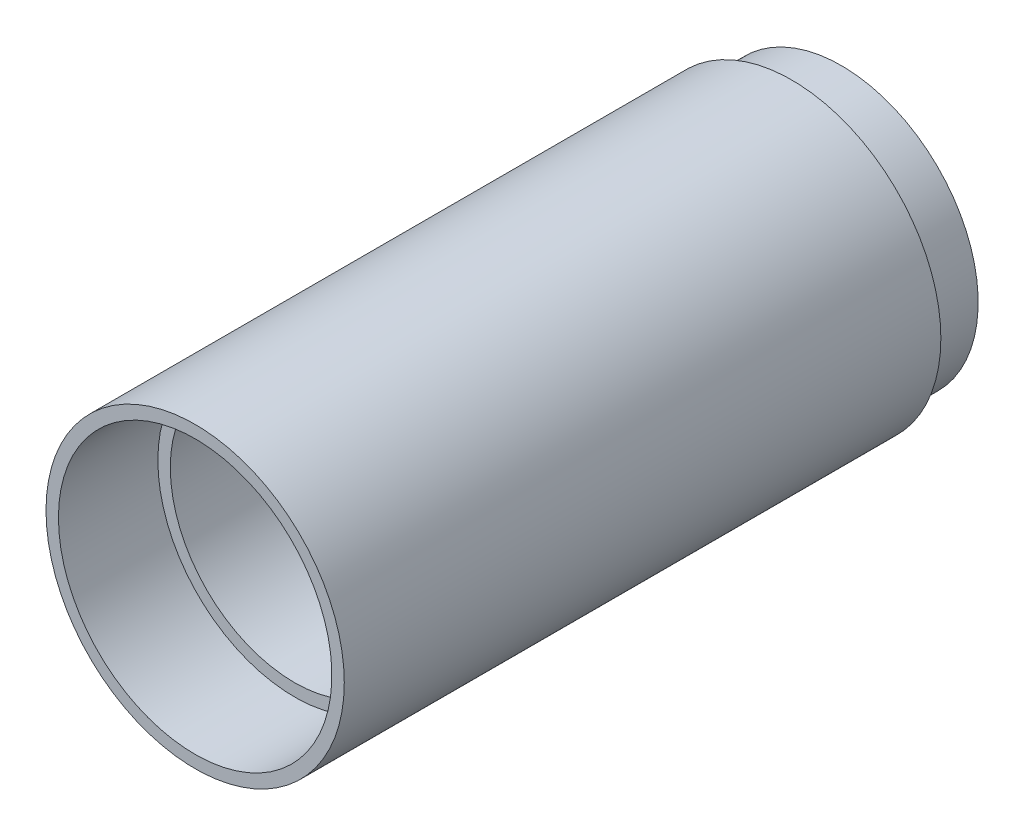
ISO-10303-21;
HEADER;
FILE_DESCRIPTION(('STEP AP214'),'2;1');
FILE_NAME('part.step','',(''),(''),'','','');
FILE_SCHEMA(('AUTOMOTIVE_DESIGN { 1 0 10303 214 1 1 1 1 }'));
ENDSEC;
DATA;
#1=APPLICATION_CONTEXT('core data for automotive mechanical design processes');
#2=APPLICATION_PROTOCOL_DEFINITION('international standard','automotive_design',2000,#1);
#3=PRODUCT_CONTEXT('',#1,'mechanical');
#4=PRODUCT('Part','Part','',(#3));
#5=PRODUCT_RELATED_PRODUCT_CATEGORY('part','',(#4));
#6=PRODUCT_DEFINITION_FORMATION('','',#4);
#7=PRODUCT_DEFINITION_CONTEXT('part definition',#1,'design');
#8=PRODUCT_DEFINITION('design','',#6,#7);
#9=PRODUCT_DEFINITION_SHAPE('','',#8);
#10=(LENGTH_UNIT() NAMED_UNIT(*) SI_UNIT(.MILLI.,.METRE.));
#11=(NAMED_UNIT(*) PLANE_ANGLE_UNIT() SI_UNIT($,.RADIAN.));
#12=(NAMED_UNIT(*) SI_UNIT($,.STERADIAN.) SOLID_ANGLE_UNIT());
#13=UNCERTAINTY_MEASURE_WITH_UNIT(LENGTH_MEASURE(1.E-05),#10,'distance_accuracy_value','');
#14=(GEOMETRIC_REPRESENTATION_CONTEXT(3) GLOBAL_UNCERTAINTY_ASSIGNED_CONTEXT((#13)) GLOBAL_UNIT_ASSIGNED_CONTEXT((#10,
#11,#12)) REPRESENTATION_CONTEXT('',''));
#15=CARTESIAN_POINT('',(0.,0.,0.));
#16=DIRECTION('',(0.,0.,1.));
#17=DIRECTION('',(1.,0.,0.));
#18=AXIS2_PLACEMENT_3D('',#15,#16,#17);
#19=CARTESIAN_POINT('',(-112.606133366651,79.5679002804118,200.));
#20=DIRECTION('',(0.,0.,1.));
#21=DIRECTION('',(1.,0.,0.));
#22=AXIS2_PLACEMENT_3D('',#19,#20,#21);
#23=PLANE('',#22);
#24=CARTESIAN_POINT('',(-112.606133366651,79.5679002804118,200.));
#25=DIRECTION('',(0.,0.,-1.));
#26=DIRECTION('',(-1.,0.,0.));
#27=AXIS2_PLACEMENT_3D('',#24,#25,#26);
#28=CIRCLE('',#27,50.);
#29=CARTESIAN_POINT('',(-162.606133366651,79.5679002804118,200.));
#30=VERTEX_POINT('',#29);
#31=EDGE_CURVE('E53',#30,#30,#28,.T.);
#32=ORIENTED_EDGE('',*,*,#31,.T.);
#33=EDGE_LOOP('',(#32));
#34=FACE_BOUND('',#33,.T.);
#35=CARTESIAN_POINT('',(-112.606133366651,79.5679002804118,200.));
#36=DIRECTION('',(0.,0.,1.));
#37=DIRECTION('',(1.,0.,0.));
#38=AXIS2_PLACEMENT_3D('',#35,#36,#37);
#39=CIRCLE('',#38,55.);
#40=CARTESIAN_POINT('',(-167.606133366651,79.5679002804118,200.));
#41=VERTEX_POINT('',#40);
#42=EDGE_CURVE('E10',#41,#41,#39,.F.);
#43=ORIENTED_EDGE('',*,*,#42,.F.);
#44=EDGE_LOOP('',(#43));
#45=FACE_BOUND('',#44,.T.);
#46=ADVANCED_FACE('F37',(#34,#45),#23,.T.);
#47=CARTESIAN_POINT('',(-112.606133366651,79.5679002804118,200.));
#48=DIRECTION('',(0.,0.,-1.));
#49=DIRECTION('',(-1.,0.,0.));
#50=AXIS2_PLACEMENT_3D('',#47,#48,#49);
#51=CYLINDRICAL_SURFACE('',#50,60.);
#52=CARTESIAN_POINT('',(-112.606133366651,79.5679002804118,0.));
#53=DIRECTION('',(0.,0.,1.));
#54=DIRECTION('',(1.,0.,0.));
#55=AXIS2_PLACEMENT_3D('',#52,#53,#54);
#56=CIRCLE('',#55,60.);
#57=CARTESIAN_POINT('',(-52.6061333666514,79.5679002804118,0.));
#58=VERTEX_POINT('',#57);
#59=EDGE_CURVE('E48',#58,#58,#56,.T.);
#60=ORIENTED_EDGE('',*,*,#59,.T.);
#61=EDGE_LOOP('',(#60));
#62=FACE_BOUND('',#61,.T.);
#63=CARTESIAN_POINT('',(-112.606133366651,79.5679002804118,239.999999999982));
#64=DIRECTION('',(0.,0.,1.));
#65=DIRECTION('',(1.,0.,0.));
#66=AXIS2_PLACEMENT_3D('',#63,#64,#65);
#67=CIRCLE('',#66,60.);
#68=CARTESIAN_POINT('',(-52.6061333666514,79.5679002804118,239.999999999982));
#69=VERTEX_POINT('',#68);
#70=EDGE_CURVE('E66',#69,#69,#67,.T.);
#71=ORIENTED_EDGE('',*,*,#70,.F.);
#72=EDGE_LOOP('',(#71));
#73=FACE_BOUND('',#72,.T.);
#74=ADVANCED_FACE('F39',(#62,#73),#51,.T.);
#75=CARTESIAN_POINT('',(-112.606133366651,79.5679002804118,0.));
#76=DIRECTION('',(0.,0.,1.));
#77=DIRECTION('',(1.,0.,0.));
#78=AXIS2_PLACEMENT_3D('',#75,#76,#77);
#79=PLANE('',#78);
#80=CARTESIAN_POINT('',(-112.606133366651,79.5679002804118,0.));
#81=DIRECTION('',(0.,0.,-1.));
#82=DIRECTION('',(-1.,0.,0.));
#83=AXIS2_PLACEMENT_3D('',#80,#81,#82);
#84=CIRCLE('',#83,55.);
#85=CARTESIAN_POINT('',(-167.606133366651,79.5679002804118,0.));
#86=VERTEX_POINT('',#85);
#87=EDGE_CURVE('E44',#86,#86,#84,.T.);
#88=ORIENTED_EDGE('',*,*,#87,.F.);
#89=EDGE_LOOP('',(#88));
#90=FACE_BOUND('',#89,.T.);
#91=ORIENTED_EDGE('',*,*,#59,.F.);
#92=EDGE_LOOP('',(#91));
#93=FACE_BOUND('',#92,.T.);
#94=ADVANCED_FACE('F85',(#90,#93),#79,.F.);
#95=CARTESIAN_POINT('',(-112.606133366651,79.5679002804118,200.));
#96=DIRECTION('',(0.,0.,-1.));
#97=DIRECTION('',(-1.,0.,0.));
#98=AXIS2_PLACEMENT_3D('',#95,#96,#97);
#99=CYLINDRICAL_SURFACE('',#98,50.);
#100=ORIENTED_EDGE('',*,*,#31,.F.);
#101=EDGE_LOOP('',(#100));
#102=FACE_BOUND('',#101,.T.);
#103=CARTESIAN_POINT('',(-112.606133366651,79.5679002804118,-20.));
#104=DIRECTION('',(0.,0.,-1.));
#105=DIRECTION('',(-1.,0.,0.));
#106=AXIS2_PLACEMENT_3D('',#103,#104,#105);
#107=CIRCLE('',#106,50.);
#108=CARTESIAN_POINT('',(-162.606133366651,79.5679002804118,-20.));
#109=VERTEX_POINT('',#108);
#110=EDGE_CURVE('E62',#109,#109,#107,.T.);
#111=ORIENTED_EDGE('',*,*,#110,.T.);
#112=EDGE_LOOP('',(#111));
#113=FACE_BOUND('',#112,.T.);
#114=ADVANCED_FACE('F92',(#102,#113),#99,.F.);
#115=CARTESIAN_POINT('',(-112.606133366651,79.5679002804118,-20.));
#116=DIRECTION('',(0.,0.,-1.));
#117=DIRECTION('',(-1.,0.,0.));
#118=AXIS2_PLACEMENT_3D('',#115,#116,#117);
#119=PLANE('',#118);
#120=CARTESIAN_POINT('',(-112.606133366651,79.5679002804118,-20.));
#121=DIRECTION('',(0.,0.,-1.));
#122=DIRECTION('',(-1.,0.,0.));
#123=AXIS2_PLACEMENT_3D('',#120,#121,#122);
#124=CIRCLE('',#123,55.);
#125=CARTESIAN_POINT('',(-167.606133366651,79.5679002804118,-20.));
#126=VERTEX_POINT('',#125);
#127=EDGE_CURVE('E56',#126,#126,#124,.T.);
#128=ORIENTED_EDGE('',*,*,#127,.T.);
#129=EDGE_LOOP('',(#128));
#130=FACE_BOUND('',#129,.T.);
#131=ORIENTED_EDGE('',*,*,#110,.F.);
#132=EDGE_LOOP('',(#131));
#133=FACE_BOUND('',#132,.T.);
#134=ADVANCED_FACE('F105',(#130,#133),#119,.T.);
#135=CARTESIAN_POINT('',(-112.606133366651,79.5679002804118,-20.));
#136=DIRECTION('',(0.,0.,1.));
#137=DIRECTION('',(1.,0.,0.));
#138=AXIS2_PLACEMENT_3D('',#135,#136,#137);
#139=CYLINDRICAL_SURFACE('',#138,55.);
#140=ORIENTED_EDGE('',*,*,#127,.F.);
#141=EDGE_LOOP('',(#140));
#142=FACE_BOUND('',#141,.T.);
#143=ORIENTED_EDGE('',*,*,#87,.T.);
#144=EDGE_LOOP('',(#143));
#145=FACE_BOUND('',#144,.T.);
#146=ADVANCED_FACE('F107',(#142,#145),#139,.T.);
#147=CARTESIAN_POINT('',(-112.606133366651,79.5679002804118,409.705627484753));
#148=DIRECTION('',(0.,0.,-1.));
#149=DIRECTION('',(-1.,0.,0.));
#150=AXIS2_PLACEMENT_3D('',#147,#148,#149);
#151=CYLINDRICAL_SURFACE('',#150,55.);
#152=CARTESIAN_POINT('',(-112.606133366651,79.5679002804118,239.999999999982));
#153=DIRECTION('',(0.,0.,1.));
#154=DIRECTION('',(1.,0.,0.));
#155=AXIS2_PLACEMENT_3D('',#152,#153,#154);
#156=CIRCLE('',#155,55.);
#157=CARTESIAN_POINT('',(-167.606133366651,79.5679002804118,239.999999999982));
#158=VERTEX_POINT('',#157);
#159=EDGE_CURVE('E70',#158,#158,#156,.T.);
#160=CARTESIAN_POINT('',(-167.606133366651,79.5679002804118,200.));
#161=CARTESIAN_POINT('',(-167.606133366651,79.5679002804118,200.416666666666));
#162=CARTESIAN_POINT('',(-167.606133366651,79.5679002804118,200.833333333333));
#163=CARTESIAN_POINT('',(-167.606133366651,79.5679002804118,201.666666666666));
#164=CARTESIAN_POINT('',(-167.606133366651,79.5679002804118,202.083333333332));
#165=CARTESIAN_POINT('',(-167.606133366651,79.5679002804118,202.916666666665));
#166=CARTESIAN_POINT('',(-167.606133366651,79.5679002804118,203.333333333332));
#167=CARTESIAN_POINT('',(-167.606133366651,79.5679002804118,204.166666666665));
#168=CARTESIAN_POINT('',(-167.606133366651,79.5679002804118,204.583333333331));
#169=CARTESIAN_POINT('',(-167.606133366651,79.5679002804118,205.416666666664));
#170=CARTESIAN_POINT('',(-167.606133366651,79.5679002804118,205.833333333331));
#171=CARTESIAN_POINT('',(-167.606133366651,79.5679002804118,206.666666666664));
#172=CARTESIAN_POINT('',(-167.606133366651,79.5679002804118,207.08333333333));
#173=CARTESIAN_POINT('',(-167.606133366651,79.5679002804118,207.916666666663));
#174=CARTESIAN_POINT('',(-167.606133366651,79.5679002804118,208.33333333333));
#175=CARTESIAN_POINT('',(-167.606133366651,79.5679002804118,209.166666666662));
#176=CARTESIAN_POINT('',(-167.606133366651,79.5679002804118,209.583333333329));
#177=CARTESIAN_POINT('',(-167.606133366651,79.5679002804118,210.416666666662));
#178=CARTESIAN_POINT('',(-167.606133366651,79.5679002804118,210.833333333328));
#179=CARTESIAN_POINT('',(-167.606133366651,79.5679002804118,211.666666666661));
#180=CARTESIAN_POINT('',(-167.606133366651,79.5679002804118,212.083333333328));
#181=CARTESIAN_POINT('',(-167.606133366651,79.5679002804118,212.916666666661));
#182=CARTESIAN_POINT('',(-167.606133366651,79.5679002804118,213.333333333327));
#183=CARTESIAN_POINT('',(-167.606133366651,79.5679002804118,214.16666666666));
#184=CARTESIAN_POINT('',(-167.606133366651,79.5679002804118,214.583333333327));
#185=CARTESIAN_POINT('',(-167.606133366651,79.5679002804118,215.41666666666));
#186=CARTESIAN_POINT('',(-167.606133366651,79.5679002804118,215.833333333326));
#187=CARTESIAN_POINT('',(-167.606133366651,79.5679002804118,216.666666666659));
#188=CARTESIAN_POINT('',(-167.606133366651,79.5679002804118,217.083333333325));
#189=CARTESIAN_POINT('',(-167.606133366651,79.5679002804118,217.916666666658));
#190=CARTESIAN_POINT('',(-167.606133366651,79.5679002804118,218.333333333325));
#191=CARTESIAN_POINT('',(-167.606133366651,79.5679002804118,219.166666666658));
#192=CARTESIAN_POINT('',(-167.606133366651,79.5679002804118,219.583333333324));
#193=CARTESIAN_POINT('',(-167.606133366651,79.5679002804118,220.416666666657));
#194=CARTESIAN_POINT('',(-167.606133366651,79.5679002804118,220.833333333324));
#195=CARTESIAN_POINT('',(-167.606133366651,79.5679002804118,221.666666666657));
#196=CARTESIAN_POINT('',(-167.606133366651,79.5679002804118,222.083333333323));
#197=CARTESIAN_POINT('',(-167.606133366651,79.5679002804118,222.916666666656));
#198=CARTESIAN_POINT('',(-167.606133366651,79.5679002804118,223.333333333323));
#199=CARTESIAN_POINT('',(-167.606133366651,79.5679002804118,224.166666666656));
#200=CARTESIAN_POINT('',(-167.606133366651,79.5679002804118,224.583333333322));
#201=CARTESIAN_POINT('',(-167.606133366651,79.5679002804118,225.416666666655));
#202=CARTESIAN_POINT('',(-167.606133366651,79.5679002804118,225.833333333322));
#203=CARTESIAN_POINT('',(-167.606133366651,79.5679002804118,226.666666666654));
#204=CARTESIAN_POINT('',(-167.606133366651,79.5679002804118,227.083333333321));
#205=CARTESIAN_POINT('',(-167.606133366651,79.5679002804118,227.916666666654));
#206=CARTESIAN_POINT('',(-167.606133366651,79.5679002804118,228.33333333332));
#207=CARTESIAN_POINT('',(-167.606133366651,79.5679002804118,229.166666666653));
#208=CARTESIAN_POINT('',(-167.606133366651,79.5679002804118,229.58333333332));
#209=CARTESIAN_POINT('',(-167.606133366651,79.5679002804118,230.416666666653));
#210=CARTESIAN_POINT('',(-167.606133366651,79.5679002804118,230.833333333319));
#211=CARTESIAN_POINT('',(-167.606133366651,79.5679002804118,231.666666666652));
#212=CARTESIAN_POINT('',(-167.606133366651,79.5679002804118,232.083333333319));
#213=CARTESIAN_POINT('',(-167.606133366651,79.5679002804118,232.916666666652));
#214=CARTESIAN_POINT('',(-167.606133366651,79.5679002804118,233.333333333318));
#215=CARTESIAN_POINT('',(-167.606133366651,79.5679002804118,234.166666666651));
#216=CARTESIAN_POINT('',(-167.606133366651,79.5679002804118,234.583333333317));
#217=CARTESIAN_POINT('',(-167.606133366651,79.5679002804118,235.41666666665));
#218=CARTESIAN_POINT('',(-167.606133366651,79.5679002804118,235.833333333317));
#219=CARTESIAN_POINT('',(-167.606133366651,79.5679002804118,236.66666666665));
#220=CARTESIAN_POINT('',(-167.606133366651,79.5679002804118,237.083333333316));
#221=CARTESIAN_POINT('',(-167.606133366651,79.5679002804118,237.916666666649));
#222=CARTESIAN_POINT('',(-167.606133366651,79.5679002804118,238.333333333316));
#223=CARTESIAN_POINT('',(-167.606133366651,79.5679002804118,239.166666666649));
#224=CARTESIAN_POINT('',(-167.606133366651,79.5679002804118,239.583333333315));
#225=CARTESIAN_POINT('',(-167.606133366651,79.5679002804118,239.999999999982));
#226=B_SPLINE_CURVE_WITH_KNOTS('',3,(#160,#161,#162,#163,#164,#165,#166,#167,#168,#169,#170,
#171,#172,#173,#174,#175,#176,#177,#178,#179,#180,#181,#182,#183,#184,#185,#186,#187,#188,#189,
#190,#191,#192,#193,#194,#195,#196,#197,#198,#199,#200,#201,#202,#203,#204,#205,#206,#207,#208,
#209,#210,#211,#212,#213,#214,#215,#216,#217,#218,#219,#220,#221,#222,#223,#224,#225),
.UNSPECIFIED.,.F.,.F.,(4,2,2,2,2,2,2,2,2,2,2,2,2,2,2,2,2,2,2,2,2,2,2,2,2,2,2,2,2,2,2,2,4),(0.,
1.24999999999942,2.49999999999886,3.74999999999828,4.99999999999773,6.24999999999715,
7.49999999999656,8.74999999999601,9.99999999999543,11.2499999999948,12.4999999999943,
13.7499999999937,14.9999999999931,16.2499999999926,17.499999999992,18.7499999999914,
19.9999999999909,21.2499999999903,22.4999999999897,23.7499999999891,24.9999999999886,
26.249999999988,27.4999999999874,28.7499999999869,29.9999999999863,31.2499999999857,
32.4999999999851,33.7499999999846,34.999999999984,36.2499999999834,37.4999999999829,
38.7499999999823,39.9999999999817),.UNSPECIFIED.);
#227=EDGE_CURVE('BSEAM76',#41,#158,#226,.T.);
#228=ORIENTED_EDGE('',*,*,#42,.T.);
#229=ORIENTED_EDGE('',*,*,#159,.T.);
#230=ORIENTED_EDGE('',*,*,#227,.T.);
#231=ORIENTED_EDGE('',*,*,#227,.F.);
#232=EDGE_LOOP('',(#228,#230,#229,#231));
#233=FACE_BOUND('',#232,.T.);
#234=ADVANCED_FACE('F76',(#233),#151,.F.);
#235=CARTESIAN_POINT('',(-79.6463338756399,-299.970850703832,239.999999999982));
#236=DIRECTION('',(0.,0.,1.));
#237=DIRECTION('',(-0.546944138603991,0.837169104331221,0.));
#238=AXIS2_PLACEMENT_3D('',#235,#236,#237);
#239=PLANE('',#238);
#240=ORIENTED_EDGE('',*,*,#159,.F.);
#241=EDGE_LOOP('',(#240));
#242=FACE_BOUND('',#241,.T.);
#243=ORIENTED_EDGE('',*,*,#70,.T.);
#244=EDGE_LOOP('',(#243));
#245=FACE_BOUND('',#244,.T.);
#246=ADVANCED_FACE('F78',(#242,#245),#239,.T.);
#247=CLOSED_SHELL('',(#46,#74,#94,#114,#134,#146,#234,#246));
#248=MANIFOLD_SOLID_BREP('B2',#247);
#249=ADVANCED_BREP_SHAPE_REPRESENTATION('',(#18,#248),#14);
#250=SHAPE_DEFINITION_REPRESENTATION(#9,#249);
ENDSEC;
END-ISO-10303-21;
